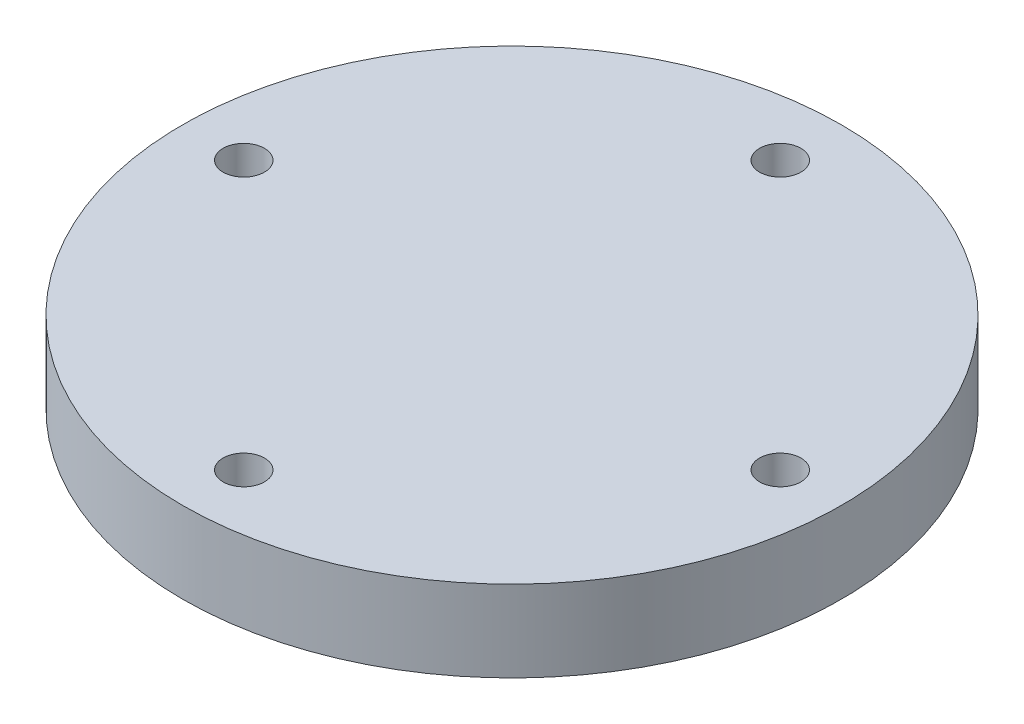
ISO-10303-21;
HEADER;
FILE_DESCRIPTION(('STEP AP214'),'2;1');
FILE_NAME('part.step','',(''),(''),'','','');
FILE_SCHEMA(('AUTOMOTIVE_DESIGN { 1 0 10303 214 1 1 1 1 }'));
ENDSEC;
DATA;
#1=APPLICATION_CONTEXT('core data for automotive mechanical design processes');
#2=APPLICATION_PROTOCOL_DEFINITION('international standard','automotive_design',2000,#1);
#3=PRODUCT_CONTEXT('',#1,'mechanical');
#4=PRODUCT('Part','Part','',(#3));
#5=PRODUCT_RELATED_PRODUCT_CATEGORY('part','',(#4));
#6=PRODUCT_DEFINITION_FORMATION('','',#4);
#7=PRODUCT_DEFINITION_CONTEXT('part definition',#1,'design');
#8=PRODUCT_DEFINITION('design','',#6,#7);
#9=PRODUCT_DEFINITION_SHAPE('','',#8);
#10=(LENGTH_UNIT() NAMED_UNIT(*) SI_UNIT(.MILLI.,.METRE.));
#11=(NAMED_UNIT(*) PLANE_ANGLE_UNIT() SI_UNIT($,.RADIAN.));
#12=(NAMED_UNIT(*) SI_UNIT($,.STERADIAN.) SOLID_ANGLE_UNIT());
#13=UNCERTAINTY_MEASURE_WITH_UNIT(LENGTH_MEASURE(1.E-05),#10,'distance_accuracy_value','');
#14=(GEOMETRIC_REPRESENTATION_CONTEXT(3) GLOBAL_UNCERTAINTY_ASSIGNED_CONTEXT((#13)) GLOBAL_UNIT_ASSIGNED_CONTEXT((#10,
#11,#12)) REPRESENTATION_CONTEXT('',''));
#15=CARTESIAN_POINT('',(0.,0.,0.));
#16=DIRECTION('',(0.,0.,1.));
#17=DIRECTION('',(1.,0.,0.));
#18=AXIS2_PLACEMENT_3D('',#15,#16,#17);
#19=CARTESIAN_POINT('',(0.,5.3,0.));
#20=DIRECTION('',(0.,-1.,0.));
#21=DIRECTION('',(0.,0.,-1.));
#22=AXIS2_PLACEMENT_3D('',#19,#20,#21);
#23=CYLINDRICAL_SURFACE('',#22,21.5);
#24=CARTESIAN_POINT('',(0.,5.3,0.));
#25=DIRECTION('',(0.,1.,0.));
#26=DIRECTION('',(0.,0.,1.));
#27=AXIS2_PLACEMENT_3D('',#24,#25,#26);
#28=CIRCLE('',#27,21.5);
#29=CARTESIAN_POINT('',(0.,5.3,21.5));
#30=VERTEX_POINT('',#29);
#31=EDGE_CURVE('E10',#30,#30,#28,.T.);
#32=ORIENTED_EDGE('',*,*,#31,.F.);
#33=EDGE_LOOP('',(#32));
#34=FACE_BOUND('',#33,.T.);
#35=CARTESIAN_POINT('',(0.,0.,0.));
#36=DIRECTION('',(0.,1.,0.));
#37=DIRECTION('',(0.,0.,1.));
#38=AXIS2_PLACEMENT_3D('',#35,#36,#37);
#39=CIRCLE('',#38,21.5);
#40=CARTESIAN_POINT('',(0.,0.,21.5));
#41=VERTEX_POINT('',#40);
#42=EDGE_CURVE('E36',#41,#41,#39,.T.);
#43=ORIENTED_EDGE('',*,*,#42,.T.);
#44=EDGE_LOOP('',(#43));
#45=FACE_BOUND('',#44,.T.);
#46=ADVANCED_FACE('F33',(#34,#45),#23,.T.);
#47=CARTESIAN_POINT('',(0.,5.3,0.));
#48=DIRECTION('',(0.,1.,0.));
#49=DIRECTION('',(0.,0.,1.));
#50=AXIS2_PLACEMENT_3D('',#47,#48,#49);
#51=PLANE('',#50);
#52=CARTESIAN_POINT('',(-17.5,5.3,0.));
#53=DIRECTION('',(0.,1.,0.));
#54=DIRECTION('',(0.,0.,1.));
#55=AXIS2_PLACEMENT_3D('',#52,#53,#54);
#56=CIRCLE('',#55,1.35);
#57=CARTESIAN_POINT('',(-17.5,5.3,1.35));
#58=VERTEX_POINT('',#57);
#59=EDGE_CURVE('E61',#58,#58,#56,.T.);
#60=ORIENTED_EDGE('',*,*,#59,.F.);
#61=EDGE_LOOP('',(#60));
#62=FACE_BOUND('',#61,.T.);
#63=CARTESIAN_POINT('',(0.,5.3,-17.5));
#64=DIRECTION('',(0.,1.,0.));
#65=DIRECTION('',(0.,0.,1.));
#66=AXIS2_PLACEMENT_3D('',#63,#64,#65);
#67=CIRCLE('',#66,1.35);
#68=CARTESIAN_POINT('',(0.,5.3,-16.15));
#69=VERTEX_POINT('',#68);
#70=EDGE_CURVE('E55',#69,#69,#67,.T.);
#71=ORIENTED_EDGE('',*,*,#70,.F.);
#72=EDGE_LOOP('',(#71));
#73=FACE_BOUND('',#72,.T.);
#74=CARTESIAN_POINT('',(17.5,5.3,0.));
#75=DIRECTION('',(0.,1.,0.));
#76=DIRECTION('',(0.,0.,1.));
#77=AXIS2_PLACEMENT_3D('',#74,#75,#76);
#78=CIRCLE('',#77,1.35);
#79=CARTESIAN_POINT('',(17.5,5.3,1.34999999999999));
#80=VERTEX_POINT('',#79);
#81=EDGE_CURVE('E48',#80,#80,#78,.T.);
#82=ORIENTED_EDGE('',*,*,#81,.F.);
#83=EDGE_LOOP('',(#82));
#84=FACE_BOUND('',#83,.T.);
#85=CARTESIAN_POINT('',(0.,5.3,17.5));
#86=DIRECTION('',(0.,1.,0.));
#87=DIRECTION('',(0.,0.,1.));
#88=AXIS2_PLACEMENT_3D('',#85,#86,#87);
#89=CIRCLE('',#88,1.35);
#90=CARTESIAN_POINT('',(0.,5.3,18.85));
#91=VERTEX_POINT('',#90);
#92=EDGE_CURVE('E49',#91,#91,#89,.T.);
#93=ORIENTED_EDGE('',*,*,#92,.F.);
#94=EDGE_LOOP('',(#93));
#95=FACE_BOUND('',#94,.T.);
#96=ORIENTED_EDGE('',*,*,#31,.T.);
#97=EDGE_LOOP('',(#96));
#98=FACE_BOUND('',#97,.T.);
#99=ADVANCED_FACE('F72',(#62,#73,#84,#95,#98),#51,.T.);
#100=CARTESIAN_POINT('',(0.,0.,0.));
#101=DIRECTION('',(0.,1.,0.));
#102=DIRECTION('',(0.,0.,1.));
#103=AXIS2_PLACEMENT_3D('',#100,#101,#102);
#104=PLANE('',#103);
#105=CARTESIAN_POINT('',(-17.5,0.,0.));
#106=DIRECTION('',(0.,1.,0.));
#107=DIRECTION('',(0.,0.,1.));
#108=AXIS2_PLACEMENT_3D('',#105,#106,#107);
#109=CIRCLE('',#108,1.35);
#110=CARTESIAN_POINT('',(-17.5,0.,1.35));
#111=VERTEX_POINT('',#110);
#112=EDGE_CURVE('E43',#111,#111,#109,.F.);
#113=ORIENTED_EDGE('',*,*,#112,.F.);
#114=EDGE_LOOP('',(#113));
#115=FACE_BOUND('',#114,.T.);
#116=CARTESIAN_POINT('',(0.,0.,-17.5));
#117=DIRECTION('',(0.,1.,0.));
#118=DIRECTION('',(0.,0.,1.));
#119=AXIS2_PLACEMENT_3D('',#116,#117,#118);
#120=CIRCLE('',#119,1.35);
#121=CARTESIAN_POINT('',(0.,0.,-16.15));
#122=VERTEX_POINT('',#121);
#123=EDGE_CURVE('E58',#122,#122,#120,.F.);
#124=ORIENTED_EDGE('',*,*,#123,.F.);
#125=EDGE_LOOP('',(#124));
#126=FACE_BOUND('',#125,.T.);
#127=CARTESIAN_POINT('',(17.5,0.,0.));
#128=DIRECTION('',(0.,1.,0.));
#129=DIRECTION('',(0.,0.,1.));
#130=AXIS2_PLACEMENT_3D('',#127,#128,#129);
#131=CIRCLE('',#130,1.35);
#132=CARTESIAN_POINT('',(17.5,0.,1.34999999999999));
#133=VERTEX_POINT('',#132);
#134=EDGE_CURVE('E52',#133,#133,#131,.F.);
#135=ORIENTED_EDGE('',*,*,#134,.F.);
#136=EDGE_LOOP('',(#135));
#137=FACE_BOUND('',#136,.T.);
#138=CARTESIAN_POINT('',(0.,0.,17.5));
#139=DIRECTION('',(0.,1.,0.));
#140=DIRECTION('',(0.,0.,1.));
#141=AXIS2_PLACEMENT_3D('',#138,#139,#140);
#142=CIRCLE('',#141,1.35);
#143=CARTESIAN_POINT('',(0.,0.,18.85));
#144=VERTEX_POINT('',#143);
#145=EDGE_CURVE('E45',#144,#144,#142,.F.);
#146=ORIENTED_EDGE('',*,*,#145,.F.);
#147=EDGE_LOOP('',(#146));
#148=FACE_BOUND('',#147,.T.);
#149=ORIENTED_EDGE('',*,*,#42,.F.);
#150=EDGE_LOOP('',(#149));
#151=FACE_BOUND('',#150,.T.);
#152=ADVANCED_FACE('F75',(#115,#126,#137,#148,#151),#104,.F.);
#153=CARTESIAN_POINT('',(0.,-0.00100000000000013,17.5));
#154=DIRECTION('',(0.,1.,0.));
#155=DIRECTION('',(0.,0.,1.));
#156=AXIS2_PLACEMENT_3D('',#153,#154,#155);
#157=CYLINDRICAL_SURFACE('',#156,1.35);
#158=CARTESIAN_POINT('',(0.,5.3,18.85));
#159=CARTESIAN_POINT('',(0.,5.24479166666667,18.85));
#160=CARTESIAN_POINT('',(0.,5.18958333333333,18.85));
#161=CARTESIAN_POINT('',(0.,5.07916666666667,18.85));
#162=CARTESIAN_POINT('',(0.,5.02395833333333,18.85));
#163=CARTESIAN_POINT('',(0.,4.91354166666667,18.85));
#164=CARTESIAN_POINT('',(0.,4.85833333333333,18.85));
#165=CARTESIAN_POINT('',(0.,4.74791666666667,18.85));
#166=CARTESIAN_POINT('',(0.,4.69270833333333,18.85));
#167=CARTESIAN_POINT('',(0.,4.58229166666667,18.85));
#168=CARTESIAN_POINT('',(0.,4.52708333333333,18.85));
#169=CARTESIAN_POINT('',(0.,4.41666666666667,18.85));
#170=CARTESIAN_POINT('',(0.,4.36145833333333,18.85));
#171=CARTESIAN_POINT('',(0.,4.25104166666667,18.85));
#172=CARTESIAN_POINT('',(0.,4.19583333333333,18.85));
#173=CARTESIAN_POINT('',(0.,4.08541666666667,18.85));
#174=CARTESIAN_POINT('',(0.,4.03020833333333,18.85));
#175=CARTESIAN_POINT('',(0.,3.91979166666667,18.85));
#176=CARTESIAN_POINT('',(0.,3.86458333333333,18.85));
#177=CARTESIAN_POINT('',(0.,3.75416666666667,18.85));
#178=CARTESIAN_POINT('',(0.,3.69895833333333,18.85));
#179=CARTESIAN_POINT('',(0.,3.58854166666667,18.85));
#180=CARTESIAN_POINT('',(0.,3.53333333333333,18.85));
#181=CARTESIAN_POINT('',(0.,3.42291666666667,18.85));
#182=CARTESIAN_POINT('',(0.,3.36770833333333,18.85));
#183=CARTESIAN_POINT('',(0.,3.25729166666667,18.85));
#184=CARTESIAN_POINT('',(0.,3.20208333333333,18.85));
#185=CARTESIAN_POINT('',(0.,3.09166666666667,18.85));
#186=CARTESIAN_POINT('',(0.,3.03645833333333,18.85));
#187=CARTESIAN_POINT('',(0.,2.92604166666667,18.85));
#188=CARTESIAN_POINT('',(0.,2.87083333333333,18.85));
#189=CARTESIAN_POINT('',(0.,2.76041666666667,18.85));
#190=CARTESIAN_POINT('',(0.,2.70520833333333,18.85));
#191=CARTESIAN_POINT('',(0.,2.59479166666667,18.85));
#192=CARTESIAN_POINT('',(0.,2.53958333333333,18.85));
#193=CARTESIAN_POINT('',(0.,2.42916666666667,18.85));
#194=CARTESIAN_POINT('',(0.,2.37395833333333,18.85));
#195=CARTESIAN_POINT('',(0.,2.26354166666667,18.85));
#196=CARTESIAN_POINT('',(0.,2.20833333333333,18.85));
#197=CARTESIAN_POINT('',(0.,2.09791666666667,18.85));
#198=CARTESIAN_POINT('',(0.,2.04270833333333,18.85));
#199=CARTESIAN_POINT('',(0.,1.93229166666667,18.85));
#200=CARTESIAN_POINT('',(0.,1.87708333333333,18.85));
#201=CARTESIAN_POINT('',(0.,1.76666666666667,18.85));
#202=CARTESIAN_POINT('',(0.,1.71145833333333,18.85));
#203=CARTESIAN_POINT('',(0.,1.60104166666667,18.85));
#204=CARTESIAN_POINT('',(0.,1.54583333333333,18.85));
#205=CARTESIAN_POINT('',(0.,1.43541666666667,18.85));
#206=CARTESIAN_POINT('',(0.,1.38020833333333,18.85));
#207=CARTESIAN_POINT('',(0.,1.26979166666667,18.85));
#208=CARTESIAN_POINT('',(0.,1.21458333333333,18.85));
#209=CARTESIAN_POINT('',(0.,1.10416666666667,18.85));
#210=CARTESIAN_POINT('',(0.,1.04895833333333,18.85));
#211=CARTESIAN_POINT('',(0.,0.938541666666666,18.85));
#212=CARTESIAN_POINT('',(0.,0.883333333333333,18.85));
#213=CARTESIAN_POINT('',(0.,0.772916666666666,18.85));
#214=CARTESIAN_POINT('',(0.,0.717708333333333,18.85));
#215=CARTESIAN_POINT('',(0.,0.607291666666666,18.85));
#216=CARTESIAN_POINT('',(0.,0.552083333333333,18.85));
#217=CARTESIAN_POINT('',(0.,0.441666666666666,18.85));
#218=CARTESIAN_POINT('',(0.,0.386458333333333,18.85));
#219=CARTESIAN_POINT('',(0.,0.276041666666667,18.85));
#220=CARTESIAN_POINT('',(0.,0.220833333333333,18.85));
#221=CARTESIAN_POINT('',(0.,0.110416666666667,18.85));
#222=CARTESIAN_POINT('',(0.,0.0552083333333334,18.85));
#223=CARTESIAN_POINT('',(0.,0.,18.85));
#224=B_SPLINE_CURVE_WITH_KNOTS('',3,(#158,#159,#160,#161,#162,#163,#164,#165,#166,#167,#168,
#169,#170,#171,#172,#173,#174,#175,#176,#177,#178,#179,#180,#181,#182,#183,#184,#185,#186,#187,
#188,#189,#190,#191,#192,#193,#194,#195,#196,#197,#198,#199,#200,#201,#202,#203,#204,#205,#206,
#207,#208,#209,#210,#211,#212,#213,#214,#215,#216,#217,#218,#219,#220,#221,#222,#223),
.UNSPECIFIED.,.F.,.F.,(4,2,2,2,2,2,2,2,2,2,2,2,2,2,2,2,2,2,2,2,2,2,2,2,2,2,2,2,2,2,2,2,4),(0.,
0.165625,0.33125,0.496875,0.6625,0.828125,0.99375,1.159375,1.325,1.490625,1.65625,1.821875,
1.9875,2.153125,2.31875,2.484375,2.65,2.815625,2.98125,3.146875,3.3125,3.478125,3.64375,
3.809375,3.975,4.140625,4.30625,4.471875,4.6375,4.803125,4.96875,5.134375,5.3),.UNSPECIFIED.);
#225=EDGE_CURVE('BSEAM83',#91,#144,#224,.T.);
#226=ORIENTED_EDGE('',*,*,#92,.T.);
#227=ORIENTED_EDGE('',*,*,#145,.T.);
#228=ORIENTED_EDGE('',*,*,#225,.T.);
#229=ORIENTED_EDGE('',*,*,#225,.F.);
#230=EDGE_LOOP('',(#226,#228,#227,#229));
#231=FACE_BOUND('',#230,.T.);
#232=ADVANCED_FACE('F83',(#231),#157,.F.);
#233=CARTESIAN_POINT('',(17.5,-0.00100000000000013,0.));
#234=DIRECTION('',(0.,1.,0.));
#235=DIRECTION('',(0.,0.,1.));
#236=AXIS2_PLACEMENT_3D('',#233,#234,#235);
#237=CYLINDRICAL_SURFACE('',#236,1.35);
#238=CARTESIAN_POINT('',(17.5,5.3,1.34999999999999));
#239=CARTESIAN_POINT('',(17.5,5.24479166666667,1.34999999999999));
#240=CARTESIAN_POINT('',(17.5,5.18958333333333,1.34999999999999));
#241=CARTESIAN_POINT('',(17.5,5.07916666666667,1.34999999999999));
#242=CARTESIAN_POINT('',(17.5,5.02395833333333,1.34999999999999));
#243=CARTESIAN_POINT('',(17.5,4.91354166666667,1.34999999999999));
#244=CARTESIAN_POINT('',(17.5,4.85833333333333,1.34999999999999));
#245=CARTESIAN_POINT('',(17.5,4.74791666666667,1.34999999999999));
#246=CARTESIAN_POINT('',(17.5,4.69270833333333,1.34999999999999));
#247=CARTESIAN_POINT('',(17.5,4.58229166666667,1.34999999999999));
#248=CARTESIAN_POINT('',(17.5,4.52708333333333,1.34999999999999));
#249=CARTESIAN_POINT('',(17.5,4.41666666666667,1.34999999999999));
#250=CARTESIAN_POINT('',(17.5,4.36145833333333,1.34999999999999));
#251=CARTESIAN_POINT('',(17.5,4.25104166666667,1.34999999999999));
#252=CARTESIAN_POINT('',(17.5,4.19583333333333,1.34999999999999));
#253=CARTESIAN_POINT('',(17.5,4.08541666666667,1.34999999999999));
#254=CARTESIAN_POINT('',(17.5,4.03020833333333,1.34999999999999));
#255=CARTESIAN_POINT('',(17.5,3.91979166666667,1.34999999999999));
#256=CARTESIAN_POINT('',(17.5,3.86458333333333,1.34999999999999));
#257=CARTESIAN_POINT('',(17.5,3.75416666666667,1.34999999999999));
#258=CARTESIAN_POINT('',(17.5,3.69895833333333,1.34999999999999));
#259=CARTESIAN_POINT('',(17.5,3.58854166666667,1.34999999999999));
#260=CARTESIAN_POINT('',(17.5,3.53333333333333,1.34999999999999));
#261=CARTESIAN_POINT('',(17.5,3.42291666666667,1.34999999999999));
#262=CARTESIAN_POINT('',(17.5,3.36770833333333,1.34999999999999));
#263=CARTESIAN_POINT('',(17.5,3.25729166666667,1.34999999999999));
#264=CARTESIAN_POINT('',(17.5,3.20208333333333,1.34999999999999));
#265=CARTESIAN_POINT('',(17.5,3.09166666666667,1.34999999999999));
#266=CARTESIAN_POINT('',(17.5,3.03645833333333,1.34999999999999));
#267=CARTESIAN_POINT('',(17.5,2.92604166666667,1.34999999999999));
#268=CARTESIAN_POINT('',(17.5,2.87083333333333,1.34999999999999));
#269=CARTESIAN_POINT('',(17.5,2.76041666666667,1.34999999999999));
#270=CARTESIAN_POINT('',(17.5,2.70520833333333,1.34999999999999));
#271=CARTESIAN_POINT('',(17.5,2.59479166666667,1.34999999999999));
#272=CARTESIAN_POINT('',(17.5,2.53958333333333,1.34999999999999));
#273=CARTESIAN_POINT('',(17.5,2.42916666666667,1.34999999999999));
#274=CARTESIAN_POINT('',(17.5,2.37395833333333,1.34999999999999));
#275=CARTESIAN_POINT('',(17.5,2.26354166666667,1.34999999999999));
#276=CARTESIAN_POINT('',(17.5,2.20833333333333,1.34999999999999));
#277=CARTESIAN_POINT('',(17.5,2.09791666666667,1.34999999999999));
#278=CARTESIAN_POINT('',(17.5,2.04270833333333,1.34999999999999));
#279=CARTESIAN_POINT('',(17.5,1.93229166666667,1.34999999999999));
#280=CARTESIAN_POINT('',(17.5,1.87708333333333,1.34999999999999));
#281=CARTESIAN_POINT('',(17.5,1.76666666666667,1.34999999999999));
#282=CARTESIAN_POINT('',(17.5,1.71145833333333,1.34999999999999));
#283=CARTESIAN_POINT('',(17.5,1.60104166666667,1.34999999999999));
#284=CARTESIAN_POINT('',(17.5,1.54583333333333,1.34999999999999));
#285=CARTESIAN_POINT('',(17.5,1.43541666666667,1.34999999999999));
#286=CARTESIAN_POINT('',(17.5,1.38020833333333,1.34999999999999));
#287=CARTESIAN_POINT('',(17.5,1.26979166666667,1.34999999999999));
#288=CARTESIAN_POINT('',(17.5,1.21458333333333,1.34999999999999));
#289=CARTESIAN_POINT('',(17.5,1.10416666666667,1.34999999999999));
#290=CARTESIAN_POINT('',(17.5,1.04895833333333,1.34999999999999));
#291=CARTESIAN_POINT('',(17.5,0.938541666666666,1.34999999999999));
#292=CARTESIAN_POINT('',(17.5,0.883333333333333,1.34999999999999));
#293=CARTESIAN_POINT('',(17.5,0.772916666666666,1.34999999999999));
#294=CARTESIAN_POINT('',(17.5,0.717708333333333,1.34999999999999));
#295=CARTESIAN_POINT('',(17.5,0.607291666666666,1.34999999999999));
#296=CARTESIAN_POINT('',(17.5,0.552083333333333,1.34999999999999));
#297=CARTESIAN_POINT('',(17.5,0.441666666666666,1.34999999999999));
#298=CARTESIAN_POINT('',(17.5,0.386458333333333,1.34999999999999));
#299=CARTESIAN_POINT('',(17.5,0.276041666666667,1.34999999999999));
#300=CARTESIAN_POINT('',(17.5,0.220833333333333,1.34999999999999));
#301=CARTESIAN_POINT('',(17.5,0.110416666666667,1.34999999999999));
#302=CARTESIAN_POINT('',(17.5,0.0552083333333334,1.34999999999999));
#303=CARTESIAN_POINT('',(17.5,0.,1.34999999999999));
#304=B_SPLINE_CURVE_WITH_KNOTS('',3,(#238,#239,#240,#241,#242,#243,#244,#245,#246,#247,#248,
#249,#250,#251,#252,#253,#254,#255,#256,#257,#258,#259,#260,#261,#262,#263,#264,#265,#266,#267,
#268,#269,#270,#271,#272,#273,#274,#275,#276,#277,#278,#279,#280,#281,#282,#283,#284,#285,#286,
#287,#288,#289,#290,#291,#292,#293,#294,#295,#296,#297,#298,#299,#300,#301,#302,#303),
.UNSPECIFIED.,.F.,.F.,(4,2,2,2,2,2,2,2,2,2,2,2,2,2,2,2,2,2,2,2,2,2,2,2,2,2,2,2,2,2,2,2,4),(0.,
0.165625,0.33125,0.496875,0.6625,0.828125,0.99375,1.159375,1.325,1.490625,1.65625,1.821875,
1.9875,2.153125,2.31875,2.484375,2.65,2.815625,2.98125,3.146875,3.3125,3.478125,3.64375,
3.809375,3.975,4.140625,4.30625,4.471875,4.6375,4.803125,4.96875,5.134375,5.3),.UNSPECIFIED.);
#305=EDGE_CURVE('BSEAM86',#80,#133,#304,.T.);
#306=ORIENTED_EDGE('',*,*,#81,.T.);
#307=ORIENTED_EDGE('',*,*,#134,.T.);
#308=ORIENTED_EDGE('',*,*,#305,.T.);
#309=ORIENTED_EDGE('',*,*,#305,.F.);
#310=EDGE_LOOP('',(#306,#308,#307,#309));
#311=FACE_BOUND('',#310,.T.);
#312=ADVANCED_FACE('F86',(#311),#237,.F.);
#313=CARTESIAN_POINT('',(0.,-0.00100000000000013,-17.5));
#314=DIRECTION('',(0.,1.,0.));
#315=DIRECTION('',(0.,0.,1.));
#316=AXIS2_PLACEMENT_3D('',#313,#314,#315);
#317=CYLINDRICAL_SURFACE('',#316,1.35);
#318=CARTESIAN_POINT('',(0.,5.3,-16.15));
#319=CARTESIAN_POINT('',(0.,5.24479166666667,-16.15));
#320=CARTESIAN_POINT('',(0.,5.18958333333333,-16.15));
#321=CARTESIAN_POINT('',(0.,5.07916666666667,-16.15));
#322=CARTESIAN_POINT('',(0.,5.02395833333333,-16.15));
#323=CARTESIAN_POINT('',(0.,4.91354166666667,-16.15));
#324=CARTESIAN_POINT('',(0.,4.85833333333333,-16.15));
#325=CARTESIAN_POINT('',(0.,4.74791666666667,-16.15));
#326=CARTESIAN_POINT('',(0.,4.69270833333333,-16.15));
#327=CARTESIAN_POINT('',(0.,4.58229166666667,-16.15));
#328=CARTESIAN_POINT('',(0.,4.52708333333333,-16.15));
#329=CARTESIAN_POINT('',(0.,4.41666666666667,-16.15));
#330=CARTESIAN_POINT('',(0.,4.36145833333333,-16.15));
#331=CARTESIAN_POINT('',(0.,4.25104166666667,-16.15));
#332=CARTESIAN_POINT('',(0.,4.19583333333333,-16.15));
#333=CARTESIAN_POINT('',(0.,4.08541666666667,-16.15));
#334=CARTESIAN_POINT('',(0.,4.03020833333333,-16.15));
#335=CARTESIAN_POINT('',(0.,3.91979166666667,-16.15));
#336=CARTESIAN_POINT('',(0.,3.86458333333333,-16.15));
#337=CARTESIAN_POINT('',(0.,3.75416666666667,-16.15));
#338=CARTESIAN_POINT('',(0.,3.69895833333333,-16.15));
#339=CARTESIAN_POINT('',(0.,3.58854166666667,-16.15));
#340=CARTESIAN_POINT('',(0.,3.53333333333333,-16.15));
#341=CARTESIAN_POINT('',(0.,3.42291666666667,-16.15));
#342=CARTESIAN_POINT('',(0.,3.36770833333333,-16.15));
#343=CARTESIAN_POINT('',(0.,3.25729166666667,-16.15));
#344=CARTESIAN_POINT('',(0.,3.20208333333333,-16.15));
#345=CARTESIAN_POINT('',(0.,3.09166666666667,-16.15));
#346=CARTESIAN_POINT('',(0.,3.03645833333333,-16.15));
#347=CARTESIAN_POINT('',(0.,2.92604166666667,-16.15));
#348=CARTESIAN_POINT('',(0.,2.87083333333333,-16.15));
#349=CARTESIAN_POINT('',(0.,2.76041666666667,-16.15));
#350=CARTESIAN_POINT('',(0.,2.70520833333333,-16.15));
#351=CARTESIAN_POINT('',(0.,2.59479166666667,-16.15));
#352=CARTESIAN_POINT('',(0.,2.53958333333333,-16.15));
#353=CARTESIAN_POINT('',(0.,2.42916666666667,-16.15));
#354=CARTESIAN_POINT('',(0.,2.37395833333333,-16.15));
#355=CARTESIAN_POINT('',(0.,2.26354166666667,-16.15));
#356=CARTESIAN_POINT('',(0.,2.20833333333333,-16.15));
#357=CARTESIAN_POINT('',(0.,2.09791666666667,-16.15));
#358=CARTESIAN_POINT('',(0.,2.04270833333333,-16.15));
#359=CARTESIAN_POINT('',(0.,1.93229166666667,-16.15));
#360=CARTESIAN_POINT('',(0.,1.87708333333333,-16.15));
#361=CARTESIAN_POINT('',(0.,1.76666666666667,-16.15));
#362=CARTESIAN_POINT('',(0.,1.71145833333333,-16.15));
#363=CARTESIAN_POINT('',(0.,1.60104166666667,-16.15));
#364=CARTESIAN_POINT('',(0.,1.54583333333333,-16.15));
#365=CARTESIAN_POINT('',(0.,1.43541666666667,-16.15));
#366=CARTESIAN_POINT('',(0.,1.38020833333333,-16.15));
#367=CARTESIAN_POINT('',(0.,1.26979166666667,-16.15));
#368=CARTESIAN_POINT('',(0.,1.21458333333333,-16.15));
#369=CARTESIAN_POINT('',(0.,1.10416666666667,-16.15));
#370=CARTESIAN_POINT('',(0.,1.04895833333333,-16.15));
#371=CARTESIAN_POINT('',(0.,0.938541666666666,-16.15));
#372=CARTESIAN_POINT('',(0.,0.883333333333333,-16.15));
#373=CARTESIAN_POINT('',(0.,0.772916666666666,-16.15));
#374=CARTESIAN_POINT('',(0.,0.717708333333333,-16.15));
#375=CARTESIAN_POINT('',(0.,0.607291666666666,-16.15));
#376=CARTESIAN_POINT('',(0.,0.552083333333333,-16.15));
#377=CARTESIAN_POINT('',(0.,0.441666666666666,-16.15));
#378=CARTESIAN_POINT('',(0.,0.386458333333333,-16.15));
#379=CARTESIAN_POINT('',(0.,0.276041666666667,-16.15));
#380=CARTESIAN_POINT('',(0.,0.220833333333333,-16.15));
#381=CARTESIAN_POINT('',(0.,0.110416666666667,-16.15));
#382=CARTESIAN_POINT('',(0.,0.0552083333333334,-16.15));
#383=CARTESIAN_POINT('',(0.,0.,-16.15));
#384=B_SPLINE_CURVE_WITH_KNOTS('',3,(#318,#319,#320,#321,#322,#323,#324,#325,#326,#327,#328,
#329,#330,#331,#332,#333,#334,#335,#336,#337,#338,#339,#340,#341,#342,#343,#344,#345,#346,#347,
#348,#349,#350,#351,#352,#353,#354,#355,#356,#357,#358,#359,#360,#361,#362,#363,#364,#365,#366,
#367,#368,#369,#370,#371,#372,#373,#374,#375,#376,#377,#378,#379,#380,#381,#382,#383),
.UNSPECIFIED.,.F.,.F.,(4,2,2,2,2,2,2,2,2,2,2,2,2,2,2,2,2,2,2,2,2,2,2,2,2,2,2,2,2,2,2,2,4),(0.,
0.165625,0.33125,0.496875,0.6625,0.828125,0.99375,1.159375,1.325,1.490625,1.65625,1.821875,
1.9875,2.153125,2.31875,2.484375,2.65,2.815625,2.98125,3.146875,3.3125,3.478125,3.64375,
3.809375,3.975,4.140625,4.30625,4.471875,4.6375,4.803125,4.96875,5.134375,5.3),.UNSPECIFIED.);
#385=EDGE_CURVE('BSEAM117',#69,#122,#384,.T.);
#386=ORIENTED_EDGE('',*,*,#70,.T.);
#387=ORIENTED_EDGE('',*,*,#123,.T.);
#388=ORIENTED_EDGE('',*,*,#385,.T.);
#389=ORIENTED_EDGE('',*,*,#385,.F.);
#390=EDGE_LOOP('',(#386,#388,#387,#389));
#391=FACE_BOUND('',#390,.T.);
#392=ADVANCED_FACE('F117',(#391),#317,.F.);
#393=CARTESIAN_POINT('',(-17.5,-0.00100000000000013,0.));
#394=DIRECTION('',(0.,1.,0.));
#395=DIRECTION('',(0.,0.,1.));
#396=AXIS2_PLACEMENT_3D('',#393,#394,#395);
#397=CYLINDRICAL_SURFACE('',#396,1.35);
#398=CARTESIAN_POINT('',(-17.5,5.3,1.35));
#399=CARTESIAN_POINT('',(-17.5,5.24479166666667,1.35));
#400=CARTESIAN_POINT('',(-17.5,5.18958333333333,1.35));
#401=CARTESIAN_POINT('',(-17.5,5.07916666666667,1.35));
#402=CARTESIAN_POINT('',(-17.5,5.02395833333333,1.35));
#403=CARTESIAN_POINT('',(-17.5,4.91354166666667,1.35));
#404=CARTESIAN_POINT('',(-17.5,4.85833333333333,1.35));
#405=CARTESIAN_POINT('',(-17.5,4.74791666666667,1.35));
#406=CARTESIAN_POINT('',(-17.5,4.69270833333333,1.35));
#407=CARTESIAN_POINT('',(-17.5,4.58229166666667,1.35));
#408=CARTESIAN_POINT('',(-17.5,4.52708333333333,1.35));
#409=CARTESIAN_POINT('',(-17.5,4.41666666666667,1.35));
#410=CARTESIAN_POINT('',(-17.5,4.36145833333333,1.35));
#411=CARTESIAN_POINT('',(-17.5,4.25104166666667,1.35));
#412=CARTESIAN_POINT('',(-17.5,4.19583333333333,1.35));
#413=CARTESIAN_POINT('',(-17.5,4.08541666666667,1.35));
#414=CARTESIAN_POINT('',(-17.5,4.03020833333333,1.35));
#415=CARTESIAN_POINT('',(-17.5,3.91979166666667,1.35));
#416=CARTESIAN_POINT('',(-17.5,3.86458333333333,1.35));
#417=CARTESIAN_POINT('',(-17.5,3.75416666666667,1.35));
#418=CARTESIAN_POINT('',(-17.5,3.69895833333333,1.35));
#419=CARTESIAN_POINT('',(-17.5,3.58854166666667,1.35));
#420=CARTESIAN_POINT('',(-17.5,3.53333333333333,1.35));
#421=CARTESIAN_POINT('',(-17.5,3.42291666666667,1.35));
#422=CARTESIAN_POINT('',(-17.5,3.36770833333333,1.35));
#423=CARTESIAN_POINT('',(-17.5,3.25729166666667,1.35));
#424=CARTESIAN_POINT('',(-17.5,3.20208333333333,1.35));
#425=CARTESIAN_POINT('',(-17.5,3.09166666666667,1.35));
#426=CARTESIAN_POINT('',(-17.5,3.03645833333333,1.35));
#427=CARTESIAN_POINT('',(-17.5,2.92604166666667,1.35));
#428=CARTESIAN_POINT('',(-17.5,2.87083333333333,1.35));
#429=CARTESIAN_POINT('',(-17.5,2.76041666666667,1.35));
#430=CARTESIAN_POINT('',(-17.5,2.70520833333333,1.35));
#431=CARTESIAN_POINT('',(-17.5,2.59479166666667,1.35));
#432=CARTESIAN_POINT('',(-17.5,2.53958333333333,1.35));
#433=CARTESIAN_POINT('',(-17.5,2.42916666666667,1.35));
#434=CARTESIAN_POINT('',(-17.5,2.37395833333333,1.35));
#435=CARTESIAN_POINT('',(-17.5,2.26354166666667,1.35));
#436=CARTESIAN_POINT('',(-17.5,2.20833333333333,1.35));
#437=CARTESIAN_POINT('',(-17.5,2.09791666666667,1.35));
#438=CARTESIAN_POINT('',(-17.5,2.04270833333333,1.35));
#439=CARTESIAN_POINT('',(-17.5,1.93229166666667,1.35));
#440=CARTESIAN_POINT('',(-17.5,1.87708333333333,1.35));
#441=CARTESIAN_POINT('',(-17.5,1.76666666666667,1.35));
#442=CARTESIAN_POINT('',(-17.5,1.71145833333333,1.35));
#443=CARTESIAN_POINT('',(-17.5,1.60104166666667,1.35));
#444=CARTESIAN_POINT('',(-17.5,1.54583333333333,1.35));
#445=CARTESIAN_POINT('',(-17.5,1.43541666666667,1.35));
#446=CARTESIAN_POINT('',(-17.5,1.38020833333333,1.35));
#447=CARTESIAN_POINT('',(-17.5,1.26979166666667,1.35));
#448=CARTESIAN_POINT('',(-17.5,1.21458333333333,1.35));
#449=CARTESIAN_POINT('',(-17.5,1.10416666666667,1.35));
#450=CARTESIAN_POINT('',(-17.5,1.04895833333333,1.35));
#451=CARTESIAN_POINT('',(-17.5,0.938541666666666,1.35));
#452=CARTESIAN_POINT('',(-17.5,0.883333333333333,1.35));
#453=CARTESIAN_POINT('',(-17.5,0.772916666666666,1.35));
#454=CARTESIAN_POINT('',(-17.5,0.717708333333333,1.35));
#455=CARTESIAN_POINT('',(-17.5,0.607291666666666,1.35));
#456=CARTESIAN_POINT('',(-17.5,0.552083333333333,1.35));
#457=CARTESIAN_POINT('',(-17.5,0.441666666666666,1.35));
#458=CARTESIAN_POINT('',(-17.5,0.386458333333333,1.35));
#459=CARTESIAN_POINT('',(-17.5,0.276041666666667,1.35));
#460=CARTESIAN_POINT('',(-17.5,0.220833333333333,1.35));
#461=CARTESIAN_POINT('',(-17.5,0.110416666666667,1.35));
#462=CARTESIAN_POINT('',(-17.5,0.0552083333333334,1.35));
#463=CARTESIAN_POINT('',(-17.5,0.,1.35));
#464=B_SPLINE_CURVE_WITH_KNOTS('',3,(#398,#399,#400,#401,#402,#403,#404,#405,#406,#407,#408,
#409,#410,#411,#412,#413,#414,#415,#416,#417,#418,#419,#420,#421,#422,#423,#424,#425,#426,#427,
#428,#429,#430,#431,#432,#433,#434,#435,#436,#437,#438,#439,#440,#441,#442,#443,#444,#445,#446,
#447,#448,#449,#450,#451,#452,#453,#454,#455,#456,#457,#458,#459,#460,#461,#462,#463),
.UNSPECIFIED.,.F.,.F.,(4,2,2,2,2,2,2,2,2,2,2,2,2,2,2,2,2,2,2,2,2,2,2,2,2,2,2,2,2,2,2,2,4),(0.,
0.165625,0.33125,0.496875,0.6625,0.828125,0.99375,1.159375,1.325,1.490625,1.65625,1.821875,
1.9875,2.153125,2.31875,2.484375,2.65,2.815625,2.98125,3.146875,3.3125,3.478125,3.64375,
3.809375,3.975,4.140625,4.30625,4.471875,4.6375,4.803125,4.96875,5.134375,5.3),.UNSPECIFIED.);
#465=EDGE_CURVE('BSEAM69',#58,#111,#464,.T.);
#466=ORIENTED_EDGE('',*,*,#59,.T.);
#467=ORIENTED_EDGE('',*,*,#112,.T.);
#468=ORIENTED_EDGE('',*,*,#465,.T.);
#469=ORIENTED_EDGE('',*,*,#465,.F.);
#470=EDGE_LOOP('',(#466,#468,#467,#469));
#471=FACE_BOUND('',#470,.T.);
#472=ADVANCED_FACE('F69',(#471),#397,.F.);
#473=CLOSED_SHELL('',(#46,#99,#152,#232,#312,#392,#472));
#474=MANIFOLD_SOLID_BREP('B2',#473);
#475=ADVANCED_BREP_SHAPE_REPRESENTATION('',(#18,#474),#14);
#476=SHAPE_DEFINITION_REPRESENTATION(#9,#475);
ENDSEC;
END-ISO-10303-21;
